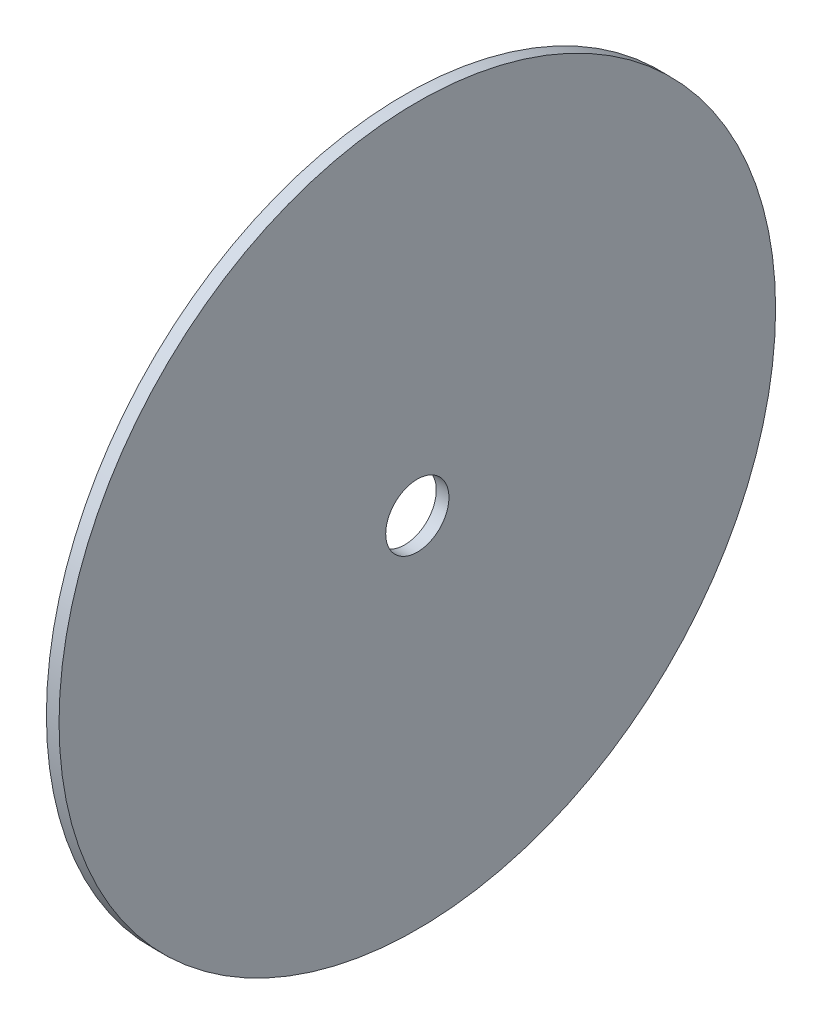
ISO-10303-21;
HEADER;
FILE_DESCRIPTION(('STEP AP214'),'2;1');
FILE_NAME('part.step','',(''),(''),'','','');
FILE_SCHEMA(('AUTOMOTIVE_DESIGN { 1 0 10303 214 1 1 1 1 }'));
ENDSEC;
DATA;
#1=APPLICATION_CONTEXT('core data for automotive mechanical design processes');
#2=APPLICATION_PROTOCOL_DEFINITION('international standard','automotive_design',2000,#1);
#3=PRODUCT_CONTEXT('',#1,'mechanical');
#4=PRODUCT('Part','Part','',(#3));
#5=PRODUCT_RELATED_PRODUCT_CATEGORY('part','',(#4));
#6=PRODUCT_DEFINITION_FORMATION('','',#4);
#7=PRODUCT_DEFINITION_CONTEXT('part definition',#1,'design');
#8=PRODUCT_DEFINITION('design','',#6,#7);
#9=PRODUCT_DEFINITION_SHAPE('','',#8);
#10=(LENGTH_UNIT() NAMED_UNIT(*) SI_UNIT(.MILLI.,.METRE.));
#11=(NAMED_UNIT(*) PLANE_ANGLE_UNIT() SI_UNIT($,.RADIAN.));
#12=(NAMED_UNIT(*) SI_UNIT($,.STERADIAN.) SOLID_ANGLE_UNIT());
#13=UNCERTAINTY_MEASURE_WITH_UNIT(LENGTH_MEASURE(1.E-05),#10,'distance_accuracy_value','');
#14=(GEOMETRIC_REPRESENTATION_CONTEXT(3) GLOBAL_UNCERTAINTY_ASSIGNED_CONTEXT((#13)) GLOBAL_UNIT_ASSIGNED_CONTEXT((#10,
#11,#12)) REPRESENTATION_CONTEXT('',''));
#15=CARTESIAN_POINT('',(0.,0.,0.));
#16=DIRECTION('',(0.,0.,1.));
#17=DIRECTION('',(1.,0.,0.));
#18=AXIS2_PLACEMENT_3D('',#15,#16,#17);
#19=CARTESIAN_POINT('',(-23.9150943396226,0.,0.));
#20=DIRECTION('',(-1.,0.,0.));
#21=DIRECTION('',(0.,0.,1.));
#22=AXIS2_PLACEMENT_3D('',#19,#20,#21);
#23=CYLINDRICAL_SURFACE('',#22,1.5);
#24=CARTESIAN_POINT('',(0.,0.,0.));
#25=DIRECTION('',(-1.,0.,0.));
#26=DIRECTION('',(0.,0.,1.));
#27=AXIS2_PLACEMENT_3D('',#24,#25,#26);
#28=CIRCLE('',#27,1.5);
#29=CARTESIAN_POINT('',(0.,0.,1.5));
#30=VERTEX_POINT('',#29);
#31=EDGE_CURVE('E10',#30,#30,#28,.T.);
#32=ORIENTED_EDGE('',*,*,#31,.F.);
#33=EDGE_LOOP('',(#32));
#34=FACE_BOUND('',#33,.T.);
#35=CARTESIAN_POINT('',(-0.6,0.,0.));
#36=DIRECTION('',(-1.,0.,0.));
#37=DIRECTION('',(0.,0.,1.));
#38=AXIS2_PLACEMENT_3D('',#35,#36,#37);
#39=CIRCLE('',#38,1.5);
#40=CARTESIAN_POINT('',(-0.6,0.,1.5));
#41=VERTEX_POINT('',#40);
#42=EDGE_CURVE('E46',#41,#41,#39,.T.);
#43=ORIENTED_EDGE('',*,*,#42,.T.);
#44=EDGE_LOOP('',(#43));
#45=FACE_BOUND('',#44,.T.);
#46=ADVANCED_FACE('F32',(#34,#45),#23,.F.);
#47=CARTESIAN_POINT('',(0.,1.5,0.));
#48=DIRECTION('',(-1.,0.,0.));
#49=DIRECTION('',(0.,0.,1.));
#50=AXIS2_PLACEMENT_3D('',#47,#48,#49);
#51=PLANE('',#50);
#52=CARTESIAN_POINT('',(0.,0.,0.));
#53=DIRECTION('',(-1.,0.,0.));
#54=DIRECTION('',(0.,0.,1.));
#55=AXIS2_PLACEMENT_3D('',#52,#53,#54);
#56=CIRCLE('',#55,17.);
#57=CARTESIAN_POINT('',(0.,0.,17.));
#58=VERTEX_POINT('',#57);
#59=EDGE_CURVE('E38',#58,#58,#56,.T.);
#60=ORIENTED_EDGE('',*,*,#59,.F.);
#61=EDGE_LOOP('',(#60));
#62=FACE_BOUND('',#61,.T.);
#63=ORIENTED_EDGE('',*,*,#31,.T.);
#64=EDGE_LOOP('',(#63));
#65=FACE_BOUND('',#64,.T.);
#66=ADVANCED_FACE('F61',(#62,#65),#51,.F.);
#67=CARTESIAN_POINT('',(-23.9150943396226,0.,0.));
#68=DIRECTION('',(-1.,0.,0.));
#69=DIRECTION('',(0.,0.,1.));
#70=AXIS2_PLACEMENT_3D('',#67,#68,#69);
#71=CYLINDRICAL_SURFACE('',#70,17.);
#72=CARTESIAN_POINT('',(-0.6,0.,0.));
#73=DIRECTION('',(-1.,0.,0.));
#74=DIRECTION('',(0.,0.,1.));
#75=AXIS2_PLACEMENT_3D('',#72,#73,#74);
#76=CIRCLE('',#75,17.);
#77=CARTESIAN_POINT('',(-0.6,0.,17.));
#78=VERTEX_POINT('',#77);
#79=EDGE_CURVE('E42',#78,#78,#76,.T.);
#80=ORIENTED_EDGE('',*,*,#79,.F.);
#81=EDGE_LOOP('',(#80));
#82=FACE_BOUND('',#81,.T.);
#83=ORIENTED_EDGE('',*,*,#59,.T.);
#84=EDGE_LOOP('',(#83));
#85=FACE_BOUND('',#84,.T.);
#86=ADVANCED_FACE('F56',(#82,#85),#71,.T.);
#87=CARTESIAN_POINT('',(-0.600000000000001,17.,0.));
#88=DIRECTION('',(1.,0.,0.));
#89=DIRECTION('',(0.,0.,-1.));
#90=AXIS2_PLACEMENT_3D('',#87,#88,#89);
#91=PLANE('',#90);
#92=ORIENTED_EDGE('',*,*,#42,.F.);
#93=EDGE_LOOP('',(#92));
#94=FACE_BOUND('',#93,.T.);
#95=ORIENTED_EDGE('',*,*,#79,.T.);
#96=EDGE_LOOP('',(#95));
#97=FACE_BOUND('',#96,.T.);
#98=ADVANCED_FACE('F53',(#94,#97),#91,.F.);
#99=CLOSED_SHELL('',(#46,#66,#86,#98));
#100=MANIFOLD_SOLID_BREP('B2',#99);
#101=ADVANCED_BREP_SHAPE_REPRESENTATION('',(#18,#100),#14);
#102=SHAPE_DEFINITION_REPRESENTATION(#9,#101);
ENDSEC;
END-ISO-10303-21;
